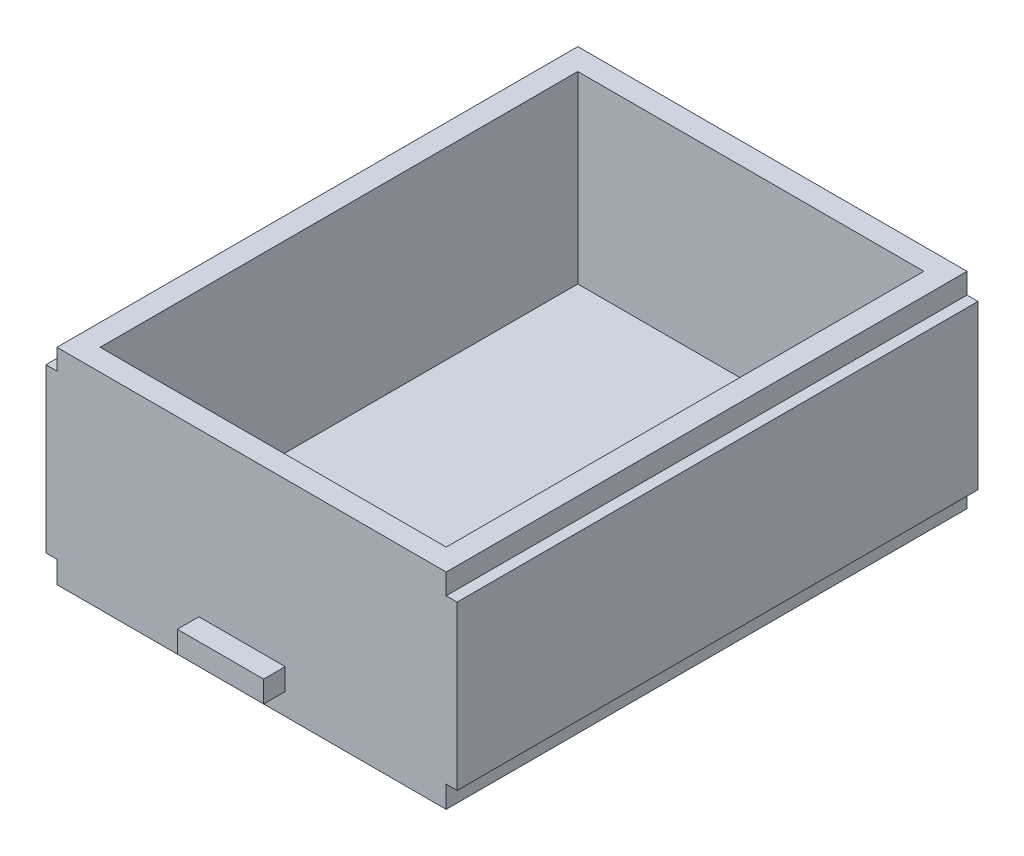
ISO-10303-21;
HEADER;
FILE_DESCRIPTION(('STEP AP214'),'2;1');
FILE_NAME('part.step','',(''),(''),'','','');
FILE_SCHEMA(('AUTOMOTIVE_DESIGN { 1 0 10303 214 1 1 1 1 }'));
ENDSEC;
DATA;
#1=APPLICATION_CONTEXT('core data for automotive mechanical design processes');
#2=APPLICATION_PROTOCOL_DEFINITION('international standard','automotive_design',2000,#1);
#3=PRODUCT_CONTEXT('',#1,'mechanical');
#4=PRODUCT('Part','Part','',(#3));
#5=PRODUCT_RELATED_PRODUCT_CATEGORY('part','',(#4));
#6=PRODUCT_DEFINITION_FORMATION('','',#4);
#7=PRODUCT_DEFINITION_CONTEXT('part definition',#1,'design');
#8=PRODUCT_DEFINITION('design','',#6,#7);
#9=PRODUCT_DEFINITION_SHAPE('','',#8);
#10=(LENGTH_UNIT() NAMED_UNIT(*) SI_UNIT(.MILLI.,.METRE.));
#11=(NAMED_UNIT(*) PLANE_ANGLE_UNIT() SI_UNIT($,.RADIAN.));
#12=(NAMED_UNIT(*) SI_UNIT($,.STERADIAN.) SOLID_ANGLE_UNIT());
#13=UNCERTAINTY_MEASURE_WITH_UNIT(LENGTH_MEASURE(1.E-05),#10,'distance_accuracy_value','');
#14=(GEOMETRIC_REPRESENTATION_CONTEXT(3) GLOBAL_UNCERTAINTY_ASSIGNED_CONTEXT((#13)) GLOBAL_UNIT_ASSIGNED_CONTEXT((#10,
#11,#12)) REPRESENTATION_CONTEXT('',''));
#15=CARTESIAN_POINT('',(0.,0.,0.));
#16=DIRECTION('',(0.,0.,1.));
#17=DIRECTION('',(1.,0.,0.));
#18=AXIS2_PLACEMENT_3D('',#15,#16,#17);
#19=CARTESIAN_POINT('',(0.,0.,96.52));
#20=DIRECTION('',(0.,0.,1.));
#21=DIRECTION('',(1.,0.,0.));
#22=AXIS2_PLACEMENT_3D('',#19,#20,#21);
#23=PLANE('',#22);
#24=DIRECTION('',(0.,-1.,0.));
#25=VECTOR('',#24,1.);
#26=CARTESIAN_POINT('',(-36.068,-19.05,96.52));
#27=LINE('',#26,#25);
#28=CARTESIAN_POINT('',(-36.068,19.05,96.52));
#29=VERTEX_POINT('',#28);
#30=CARTESIAN_POINT('',(-36.068,15.24,96.52));
#31=VERTEX_POINT('',#30);
#32=EDGE_CURVE('E332',#29,#31,#27,.T.);
#33=ORIENTED_EDGE('',*,*,#32,.T.);
#34=DIRECTION('',(-1.,0.,0.));
#35=VECTOR('',#34,1.);
#36=CARTESIAN_POINT('',(-36.068,15.24,96.52));
#37=LINE('',#36,#35);
#38=CARTESIAN_POINT('',(-38.1,15.24,96.52));
#39=VERTEX_POINT('',#38);
#40=EDGE_CURVE('E71',#31,#39,#37,.T.);
#41=ORIENTED_EDGE('',*,*,#40,.T.);
#42=DIRECTION('',(0.,-1.,0.));
#43=VECTOR('',#42,1.);
#44=CARTESIAN_POINT('',(-38.1,15.24,96.52));
#45=LINE('',#44,#43);
#46=CARTESIAN_POINT('',(-38.1,-14.986,96.52));
#47=VERTEX_POINT('',#46);
#48=EDGE_CURVE('E237',#39,#47,#45,.T.);
#49=ORIENTED_EDGE('',*,*,#48,.T.);
#50=DIRECTION('',(1.,0.,0.));
#51=VECTOR('',#50,1.);
#52=CARTESIAN_POINT('',(-36.068,-14.986,96.52));
#53=LINE('',#52,#51);
#54=CARTESIAN_POINT('',(-36.068,-14.986,96.52));
#55=VERTEX_POINT('',#54);
#56=EDGE_CURVE('E227',#47,#55,#53,.T.);
#57=ORIENTED_EDGE('',*,*,#56,.T.);
#58=CARTESIAN_POINT('',(-36.068,-19.05,96.52));
#59=VERTEX_POINT('',#58);
#60=EDGE_CURVE('E337',#55,#59,#27,.T.);
#61=ORIENTED_EDGE('',*,*,#60,.T.);
#62=DIRECTION('',(1.,0.,0.));
#63=VECTOR('',#62,1.);
#64=CARTESIAN_POINT('',(36.068,-19.05,96.52));
#65=LINE('',#64,#63);
#66=CARTESIAN_POINT('',(36.068,-19.05,96.52));
#67=VERTEX_POINT('',#66);
#68=EDGE_CURVE('E336',#59,#67,#65,.T.);
#69=ORIENTED_EDGE('',*,*,#68,.T.);
#70=DIRECTION('',(0.,1.,0.));
#71=VECTOR('',#70,1.);
#72=CARTESIAN_POINT('',(36.068,-19.05,96.52));
#73=LINE('',#72,#71);
#74=CARTESIAN_POINT('',(36.068,-14.986,96.52));
#75=VERTEX_POINT('',#74);
#76=EDGE_CURVE('E341',#67,#75,#73,.T.);
#77=ORIENTED_EDGE('',*,*,#76,.T.);
#78=DIRECTION('',(1.,0.,0.));
#79=VECTOR('',#78,1.);
#80=CARTESIAN_POINT('',(36.068,-14.986,96.52));
#81=LINE('',#80,#79);
#82=CARTESIAN_POINT('',(38.1,-14.986,96.52));
#83=VERTEX_POINT('',#82);
#84=EDGE_CURVE('E238',#75,#83,#81,.T.);
#85=ORIENTED_EDGE('',*,*,#84,.T.);
#86=DIRECTION('',(0.,1.,0.));
#87=VECTOR('',#86,1.);
#88=CARTESIAN_POINT('',(38.1,15.24,96.52));
#89=LINE('',#88,#87);
#90=CARTESIAN_POINT('',(38.1,15.24,96.52));
#91=VERTEX_POINT('',#90);
#92=EDGE_CURVE('E271',#83,#91,#89,.T.);
#93=ORIENTED_EDGE('',*,*,#92,.T.);
#94=DIRECTION('',(-1.,0.,0.));
#95=VECTOR('',#94,1.);
#96=CARTESIAN_POINT('',(36.068,15.24,96.52));
#97=LINE('',#96,#95);
#98=CARTESIAN_POINT('',(36.068,15.24,96.52));
#99=VERTEX_POINT('',#98);
#100=EDGE_CURVE('E267',#91,#99,#97,.T.);
#101=ORIENTED_EDGE('',*,*,#100,.T.);
#102=CARTESIAN_POINT('',(36.068,19.05,96.52));
#103=VERTEX_POINT('',#102);
#104=EDGE_CURVE('E340',#99,#103,#73,.T.);
#105=ORIENTED_EDGE('',*,*,#104,.T.);
#106=DIRECTION('',(-1.,0.,0.));
#107=VECTOR('',#106,1.);
#108=CARTESIAN_POINT('',(36.068,19.05,96.52));
#109=LINE('',#108,#107);
#110=EDGE_CURVE('E345',#103,#29,#109,.T.);
#111=ORIENTED_EDGE('',*,*,#110,.T.);
#112=EDGE_LOOP('',(#33,#41,#49,#57,#61,#69,#77,#85,#93,#101,#105,#111));
#113=FACE_BOUND('',#112,.T.);
#114=DIRECTION('',(1.,0.,0.));
#115=VECTOR('',#114,1.);
#116=CARTESIAN_POINT('',(6.2297280759648,-15.05,96.52));
#117=LINE('',#116,#115);
#118=CARTESIAN_POINT('',(-9.7702719240352,-15.05,96.52));
#119=VERTEX_POINT('',#118);
#120=CARTESIAN_POINT('',(6.2297280759648,-15.05,96.52));
#121=VERTEX_POINT('',#120);
#122=EDGE_CURVE('E575',#119,#121,#117,.T.);
#123=ORIENTED_EDGE('',*,*,#122,.F.);
#124=DIRECTION('',(0.,-1.,0.));
#125=VECTOR('',#124,1.);
#126=CARTESIAN_POINT('',(-9.7702719240352,-15.05,96.52));
#127=LINE('',#126,#125);
#128=CARTESIAN_POINT('',(-9.7702719240352,-11.05,96.52));
#129=VERTEX_POINT('',#128);
#130=EDGE_CURVE('E210',#129,#119,#127,.T.);
#131=ORIENTED_EDGE('',*,*,#130,.F.);
#132=DIRECTION('',(-1.,0.,0.));
#133=VECTOR('',#132,1.);
#134=CARTESIAN_POINT('',(6.2297280759648,-11.05,96.52));
#135=LINE('',#134,#133);
#136=CARTESIAN_POINT('',(6.2297280759648,-11.05,96.52));
#137=VERTEX_POINT('',#136);
#138=EDGE_CURVE('E206',#137,#129,#135,.T.);
#139=ORIENTED_EDGE('',*,*,#138,.F.);
#140=DIRECTION('',(0.,1.,0.));
#141=VECTOR('',#140,1.);
#142=CARTESIAN_POINT('',(6.2297280759648,-15.05,96.52));
#143=LINE('',#142,#141);
#144=EDGE_CURVE('E571',#121,#137,#143,.T.);
#145=ORIENTED_EDGE('',*,*,#144,.F.);
#146=EDGE_LOOP('',(#123,#131,#139,#145));
#147=FACE_BOUND('',#146,.T.);
#148=ADVANCED_FACE('F47',(#113,#147),#23,.T.);
#149=CARTESIAN_POINT('',(-36.068,-19.05,96.52));
#150=DIRECTION('',(1.,0.,0.));
#151=DIRECTION('',(0.,0.,-1.));
#152=AXIS2_PLACEMENT_3D('',#149,#150,#151);
#153=PLANE('',#152);
#154=DIRECTION('',(0.,0.,1.));
#155=VECTOR('',#154,1.);
#156=CARTESIAN_POINT('',(-36.068,-14.986,0.));
#157=LINE('',#156,#155);
#158=CARTESIAN_POINT('',(-36.068,-14.986,0.));
#159=VERTEX_POINT('',#158);
#160=EDGE_CURVE('E245',#159,#55,#157,.T.);
#161=ORIENTED_EDGE('',*,*,#160,.F.);
#162=DIRECTION('',(0.,-1.,0.));
#163=VECTOR('',#162,1.);
#164=CARTESIAN_POINT('',(-36.068,-19.05,0.));
#165=LINE('',#164,#163);
#166=CARTESIAN_POINT('',(-36.068,-19.05,0.));
#167=VERTEX_POINT('',#166);
#168=EDGE_CURVE('E296',#159,#167,#165,.T.);
#169=ORIENTED_EDGE('',*,*,#168,.T.);
#170=DIRECTION('',(0.,0.,-1.));
#171=VECTOR('',#170,1.);
#172=CARTESIAN_POINT('',(-36.068,-19.05,96.52));
#173=LINE('',#172,#171);
#174=EDGE_CURVE('E11',#59,#167,#173,.T.);
#175=ORIENTED_EDGE('',*,*,#174,.F.);
#176=ORIENTED_EDGE('',*,*,#60,.F.);
#177=EDGE_LOOP('',(#161,#169,#175,#176));
#178=FACE_BOUND('',#177,.T.);
#179=ADVANCED_FACE('F397',(#178),#153,.F.);
#180=CARTESIAN_POINT('',(36.068,-19.05,96.52));
#181=DIRECTION('',(-1.,0.,0.));
#182=DIRECTION('',(0.,0.,1.));
#183=AXIS2_PLACEMENT_3D('',#180,#181,#182);
#184=PLANE('',#183);
#185=DIRECTION('',(0.,0.,1.));
#186=VECTOR('',#185,1.);
#187=CARTESIAN_POINT('',(36.068,15.24,0.));
#188=LINE('',#187,#186);
#189=CARTESIAN_POINT('',(36.068,15.24,0.));
#190=VERTEX_POINT('',#189);
#191=EDGE_CURVE('E213',#190,#99,#188,.T.);
#192=ORIENTED_EDGE('',*,*,#191,.F.);
#193=DIRECTION('',(0.,1.,0.));
#194=VECTOR('',#193,1.);
#195=CARTESIAN_POINT('',(36.068,-19.05,0.));
#196=LINE('',#195,#194);
#197=CARTESIAN_POINT('',(36.068,19.05,0.));
#198=VERTEX_POINT('',#197);
#199=EDGE_CURVE('E356',#190,#198,#196,.T.);
#200=ORIENTED_EDGE('',*,*,#199,.T.);
#201=DIRECTION('',(0.,0.,-1.));
#202=VECTOR('',#201,1.);
#203=CARTESIAN_POINT('',(36.068,19.05,96.52));
#204=LINE('',#203,#202);
#205=EDGE_CURVE('E367',#103,#198,#204,.T.);
#206=ORIENTED_EDGE('',*,*,#205,.F.);
#207=ORIENTED_EDGE('',*,*,#104,.F.);
#208=EDGE_LOOP('',(#192,#200,#206,#207));
#209=FACE_BOUND('',#208,.T.);
#210=ADVANCED_FACE('F410',(#209),#184,.F.);
#211=CARTESIAN_POINT('',(36.068,19.05,96.52));
#212=DIRECTION('',(0.,-1.,0.));
#213=DIRECTION('',(1.,0.,0.));
#214=AXIS2_PLACEMENT_3D('',#211,#212,#213);
#215=PLANE('',#214);
#216=DIRECTION('',(-1.,0.,0.));
#217=VECTOR('',#216,1.);
#218=CARTESIAN_POINT('',(36.068,19.05,0.));
#219=LINE('',#218,#217);
#220=CARTESIAN_POINT('',(-36.068,19.05,0.));
#221=VERTEX_POINT('',#220);
#222=EDGE_CURVE('E361',#198,#221,#219,.T.);
#223=ORIENTED_EDGE('',*,*,#222,.T.);
#224=DIRECTION('',(0.,0.,-1.));
#225=VECTOR('',#224,1.);
#226=CARTESIAN_POINT('',(-36.068,19.05,96.52));
#227=LINE('',#226,#225);
#228=EDGE_CURVE('E348',#29,#221,#227,.T.);
#229=ORIENTED_EDGE('',*,*,#228,.F.);
#230=ORIENTED_EDGE('',*,*,#110,.F.);
#231=ORIENTED_EDGE('',*,*,#205,.T.);
#232=EDGE_LOOP('',(#223,#229,#230,#231));
#233=FACE_BOUND('',#232,.T.);
#234=DIRECTION('',(-1.,0.,0.));
#235=VECTOR('',#234,1.);
#236=CARTESIAN_POINT('',(36.068,19.05,4.));
#237=LINE('',#236,#235);
#238=CARTESIAN_POINT('',(32.068,19.05,4.));
#239=VERTEX_POINT('',#238);
#240=CARTESIAN_POINT('',(-32.068,19.05,4.));
#241=VERTEX_POINT('',#240);
#242=EDGE_CURVE('E303',#239,#241,#237,.T.);
#243=ORIENTED_EDGE('',*,*,#242,.F.);
#244=DIRECTION('',(0.,0.,-1.));
#245=VECTOR('',#244,1.);
#246=CARTESIAN_POINT('',(32.068,19.05,96.52));
#247=LINE('',#246,#245);
#248=CARTESIAN_POINT('',(32.068,19.05,92.52));
#249=VERTEX_POINT('',#248);
#250=EDGE_CURVE('E310',#249,#239,#247,.T.);
#251=ORIENTED_EDGE('',*,*,#250,.F.);
#252=DIRECTION('',(-1.,0.,0.));
#253=VECTOR('',#252,1.);
#254=CARTESIAN_POINT('',(36.068,19.05,92.52));
#255=LINE('',#254,#253);
#256=CARTESIAN_POINT('',(-32.068,19.05,92.52));
#257=VERTEX_POINT('',#256);
#258=EDGE_CURVE('E319',#249,#257,#255,.T.);
#259=ORIENTED_EDGE('',*,*,#258,.T.);
#260=DIRECTION('',(0.,0.,-1.));
#261=VECTOR('',#260,1.);
#262=CARTESIAN_POINT('',(-32.068,19.05,96.52));
#263=LINE('',#262,#261);
#264=EDGE_CURVE('E320',#257,#241,#263,.T.);
#265=ORIENTED_EDGE('',*,*,#264,.T.);
#266=EDGE_LOOP('',(#243,#251,#259,#265));
#267=FACE_BOUND('',#266,.T.);
#268=ADVANCED_FACE('F414',(#233,#267),#215,.F.);
#269=CARTESIAN_POINT('',(-36.068,15.24,0.));
#270=VERTEX_POINT('',#269);
#271=EDGE_CURVE('E349',#221,#270,#165,.T.);
#272=ORIENTED_EDGE('',*,*,#271,.T.);
#273=DIRECTION('',(0.,0.,1.));
#274=VECTOR('',#273,1.);
#275=CARTESIAN_POINT('',(-36.068,15.24,0.));
#276=LINE('',#275,#274);
#277=EDGE_CURVE('E234',#270,#31,#276,.T.);
#278=ORIENTED_EDGE('',*,*,#277,.T.);
#279=ORIENTED_EDGE('',*,*,#32,.F.);
#280=ORIENTED_EDGE('',*,*,#228,.T.);
#281=EDGE_LOOP('',(#272,#278,#279,#280));
#282=FACE_BOUND('',#281,.T.);
#283=ADVANCED_FACE('F49',(#282),#153,.F.);
#284=CARTESIAN_POINT('',(36.068,-19.05,96.52));
#285=DIRECTION('',(0.,1.,0.));
#286=DIRECTION('',(-1.,0.,0.));
#287=AXIS2_PLACEMENT_3D('',#284,#285,#286);
#288=PLANE('',#287);
#289=DIRECTION('',(1.,0.,0.));
#290=VECTOR('',#289,1.);
#291=CARTESIAN_POINT('',(36.068,-19.05,0.));
#292=LINE('',#291,#290);
#293=CARTESIAN_POINT('',(36.068,-19.05,0.));
#294=VERTEX_POINT('',#293);
#295=EDGE_CURVE('E353',#167,#294,#292,.T.);
#296=ORIENTED_EDGE('',*,*,#295,.T.);
#297=DIRECTION('',(0.,0.,-1.));
#298=VECTOR('',#297,1.);
#299=CARTESIAN_POINT('',(36.068,-19.05,96.52));
#300=LINE('',#299,#298);
#301=EDGE_CURVE('E56',#67,#294,#300,.T.);
#302=ORIENTED_EDGE('',*,*,#301,.F.);
#303=ORIENTED_EDGE('',*,*,#68,.F.);
#304=ORIENTED_EDGE('',*,*,#174,.T.);
#305=EDGE_LOOP('',(#296,#302,#303,#304));
#306=FACE_BOUND('',#305,.T.);
#307=ADVANCED_FACE('F394',(#306),#288,.F.);
#308=CARTESIAN_POINT('',(36.068,-14.986,0.));
#309=VERTEX_POINT('',#308);
#310=EDGE_CURVE('E357',#294,#309,#196,.T.);
#311=ORIENTED_EDGE('',*,*,#310,.T.);
#312=DIRECTION('',(0.,0.,1.));
#313=VECTOR('',#312,1.);
#314=CARTESIAN_POINT('',(36.068,-14.986,0.));
#315=LINE('',#314,#313);
#316=EDGE_CURVE('E257',#309,#75,#315,.T.);
#317=ORIENTED_EDGE('',*,*,#316,.T.);
#318=ORIENTED_EDGE('',*,*,#76,.F.);
#319=ORIENTED_EDGE('',*,*,#301,.T.);
#320=EDGE_LOOP('',(#311,#317,#318,#319));
#321=FACE_BOUND('',#320,.T.);
#322=ADVANCED_FACE('F376',(#321),#184,.F.);
#323=CARTESIAN_POINT('',(0.,0.,0.));
#324=DIRECTION('',(0.,0.,1.));
#325=DIRECTION('',(1.,0.,0.));
#326=AXIS2_PLACEMENT_3D('',#323,#324,#325);
#327=PLANE('',#326);
#328=ORIENTED_EDGE('',*,*,#271,.F.);
#329=ORIENTED_EDGE('',*,*,#222,.F.);
#330=ORIENTED_EDGE('',*,*,#199,.F.);
#331=DIRECTION('',(-1.,0.,0.));
#332=VECTOR('',#331,1.);
#333=CARTESIAN_POINT('',(36.068,15.24,0.));
#334=LINE('',#333,#332);
#335=CARTESIAN_POINT('',(38.1,15.24,0.));
#336=VERTEX_POINT('',#335);
#337=EDGE_CURVE('E261',#336,#190,#334,.T.);
#338=ORIENTED_EDGE('',*,*,#337,.F.);
#339=DIRECTION('',(0.,1.,0.));
#340=VECTOR('',#339,1.);
#341=CARTESIAN_POINT('',(38.1,15.24,0.));
#342=LINE('',#341,#340);
#343=CARTESIAN_POINT('',(38.1,-14.986,0.));
#344=VERTEX_POINT('',#343);
#345=EDGE_CURVE('E281',#344,#336,#342,.T.);
#346=ORIENTED_EDGE('',*,*,#345,.F.);
#347=DIRECTION('',(1.,0.,0.));
#348=VECTOR('',#347,1.);
#349=CARTESIAN_POINT('',(36.068,-14.986,0.));
#350=LINE('',#349,#348);
#351=EDGE_CURVE('E272',#309,#344,#350,.T.);
#352=ORIENTED_EDGE('',*,*,#351,.F.);
#353=ORIENTED_EDGE('',*,*,#310,.F.);
#354=ORIENTED_EDGE('',*,*,#295,.F.);
#355=ORIENTED_EDGE('',*,*,#168,.F.);
#356=DIRECTION('',(1.,0.,0.));
#357=VECTOR('',#356,1.);
#358=CARTESIAN_POINT('',(-36.068,-14.986,0.));
#359=LINE('',#358,#357);
#360=CARTESIAN_POINT('',(-38.1,-14.986,0.));
#361=VERTEX_POINT('',#360);
#362=EDGE_CURVE('E231',#361,#159,#359,.T.);
#363=ORIENTED_EDGE('',*,*,#362,.F.);
#364=DIRECTION('',(0.,-1.,0.));
#365=VECTOR('',#364,1.);
#366=CARTESIAN_POINT('',(-38.1,15.24,0.));
#367=LINE('',#366,#365);
#368=CARTESIAN_POINT('',(-38.1,15.24,0.));
#369=VERTEX_POINT('',#368);
#370=EDGE_CURVE('E226',#369,#361,#367,.T.);
#371=ORIENTED_EDGE('',*,*,#370,.F.);
#372=DIRECTION('',(-1.,0.,0.));
#373=VECTOR('',#372,1.);
#374=CARTESIAN_POINT('',(-36.068,15.24,0.));
#375=LINE('',#374,#373);
#376=EDGE_CURVE('E222',#270,#369,#375,.T.);
#377=ORIENTED_EDGE('',*,*,#376,.F.);
#378=EDGE_LOOP('',(#328,#329,#330,#338,#346,#352,#353,#354,#355,#363,#371,#377));
#379=FACE_BOUND('',#378,.T.);
#380=ADVANCED_FACE('F383',(#379),#327,.F.);
#381=CARTESIAN_POINT('',(-32.068,-19.05,96.52));
#382=DIRECTION('',(1.,0.,0.));
#383=DIRECTION('',(0.,0.,-1.));
#384=AXIS2_PLACEMENT_3D('',#381,#382,#383);
#385=PLANE('',#384);
#386=DIRECTION('',(0.,-1.,0.));
#387=VECTOR('',#386,1.);
#388=CARTESIAN_POINT('',(-32.068,-19.05,4.));
#389=LINE('',#388,#387);
#390=CARTESIAN_POINT('',(-32.068,-15.05,4.));
#391=VERTEX_POINT('',#390);
#392=EDGE_CURVE('E248',#241,#391,#389,.T.);
#393=ORIENTED_EDGE('',*,*,#392,.F.);
#394=ORIENTED_EDGE('',*,*,#264,.F.);
#395=DIRECTION('',(0.,-1.,0.));
#396=VECTOR('',#395,1.);
#397=CARTESIAN_POINT('',(-32.068,-19.05,92.52));
#398=LINE('',#397,#396);
#399=CARTESIAN_POINT('',(-32.068,-15.05,92.52));
#400=VERTEX_POINT('',#399);
#401=EDGE_CURVE('E298',#257,#400,#398,.T.);
#402=ORIENTED_EDGE('',*,*,#401,.T.);
#403=DIRECTION('',(0.,0.,-1.));
#404=VECTOR('',#403,1.);
#405=CARTESIAN_POINT('',(-32.068,-15.05,96.52));
#406=LINE('',#405,#404);
#407=EDGE_CURVE('E292',#400,#391,#406,.T.);
#408=ORIENTED_EDGE('',*,*,#407,.T.);
#409=EDGE_LOOP('',(#393,#394,#402,#408));
#410=FACE_BOUND('',#409,.T.);
#411=ADVANCED_FACE('F447',(#410),#385,.T.);
#412=CARTESIAN_POINT('',(36.068,-15.05,96.52));
#413=DIRECTION('',(0.,1.,0.));
#414=DIRECTION('',(-1.,0.,0.));
#415=AXIS2_PLACEMENT_3D('',#412,#413,#414);
#416=PLANE('',#415);
#417=DIRECTION('',(1.,0.,0.));
#418=VECTOR('',#417,1.);
#419=CARTESIAN_POINT('',(36.068,-15.05,4.));
#420=LINE('',#419,#418);
#421=CARTESIAN_POINT('',(32.068,-15.05,4.));
#422=VERTEX_POINT('',#421);
#423=EDGE_CURVE('E291',#391,#422,#420,.T.);
#424=ORIENTED_EDGE('',*,*,#423,.F.);
#425=ORIENTED_EDGE('',*,*,#407,.F.);
#426=DIRECTION('',(1.,0.,0.));
#427=VECTOR('',#426,1.);
#428=CARTESIAN_POINT('',(36.068,-15.05,92.52));
#429=LINE('',#428,#427);
#430=CARTESIAN_POINT('',(32.068,-15.05,92.52));
#431=VERTEX_POINT('',#430);
#432=EDGE_CURVE('E302',#400,#431,#429,.T.);
#433=ORIENTED_EDGE('',*,*,#432,.T.);
#434=DIRECTION('',(0.,0.,-1.));
#435=VECTOR('',#434,1.);
#436=CARTESIAN_POINT('',(32.068,-15.05,96.52));
#437=LINE('',#436,#435);
#438=EDGE_CURVE('E297',#431,#422,#437,.T.);
#439=ORIENTED_EDGE('',*,*,#438,.T.);
#440=EDGE_LOOP('',(#424,#425,#433,#439));
#441=FACE_BOUND('',#440,.T.);
#442=ADVANCED_FACE('F620',(#441),#416,.T.);
#443=CARTESIAN_POINT('',(32.068,-19.05,96.52));
#444=DIRECTION('',(-1.,0.,0.));
#445=DIRECTION('',(0.,0.,1.));
#446=AXIS2_PLACEMENT_3D('',#443,#444,#445);
#447=PLANE('',#446);
#448=DIRECTION('',(0.,1.,0.));
#449=VECTOR('',#448,1.);
#450=CARTESIAN_POINT('',(32.068,-19.05,4.));
#451=LINE('',#450,#449);
#452=EDGE_CURVE('E306',#422,#239,#451,.T.);
#453=ORIENTED_EDGE('',*,*,#452,.F.);
#454=ORIENTED_EDGE('',*,*,#438,.F.);
#455=DIRECTION('',(0.,1.,0.));
#456=VECTOR('',#455,1.);
#457=CARTESIAN_POINT('',(32.068,-19.05,92.52));
#458=LINE('',#457,#456);
#459=EDGE_CURVE('E313',#431,#249,#458,.T.);
#460=ORIENTED_EDGE('',*,*,#459,.T.);
#461=ORIENTED_EDGE('',*,*,#250,.T.);
#462=EDGE_LOOP('',(#453,#454,#460,#461));
#463=FACE_BOUND('',#462,.T.);
#464=ADVANCED_FACE('F612',(#463),#447,.T.);
#465=CARTESIAN_POINT('',(0.,0.,92.52));
#466=DIRECTION('',(0.,0.,1.));
#467=DIRECTION('',(1.,0.,0.));
#468=AXIS2_PLACEMENT_3D('',#465,#466,#467);
#469=PLANE('',#468);
#470=ORIENTED_EDGE('',*,*,#401,.F.);
#471=ORIENTED_EDGE('',*,*,#258,.F.);
#472=ORIENTED_EDGE('',*,*,#459,.F.);
#473=ORIENTED_EDGE('',*,*,#432,.F.);
#474=EDGE_LOOP('',(#470,#471,#472,#473));
#475=FACE_BOUND('',#474,.T.);
#476=ADVANCED_FACE('F604',(#475),#469,.F.);
#477=CARTESIAN_POINT('',(0.,0.,4.));
#478=DIRECTION('',(0.,0.,1.));
#479=DIRECTION('',(1.,0.,0.));
#480=AXIS2_PLACEMENT_3D('',#477,#478,#479);
#481=PLANE('',#480);
#482=ORIENTED_EDGE('',*,*,#392,.T.);
#483=ORIENTED_EDGE('',*,*,#423,.T.);
#484=ORIENTED_EDGE('',*,*,#452,.T.);
#485=ORIENTED_EDGE('',*,*,#242,.T.);
#486=EDGE_LOOP('',(#482,#483,#484,#485));
#487=FACE_BOUND('',#486,.T.);
#488=ADVANCED_FACE('F443',(#487),#481,.T.);
#489=CARTESIAN_POINT('',(36.068,15.24,0.));
#490=DIRECTION('',(0.,1.,0.));
#491=DIRECTION('',(0.,0.,1.));
#492=AXIS2_PLACEMENT_3D('',#489,#490,#491);
#493=PLANE('',#492);
#494=ORIENTED_EDGE('',*,*,#100,.F.);
#495=DIRECTION('',(0.,0.,1.));
#496=VECTOR('',#495,1.);
#497=CARTESIAN_POINT('',(38.1,15.24,0.));
#498=LINE('',#497,#496);
#499=EDGE_CURVE('E217',#336,#91,#498,.T.);
#500=ORIENTED_EDGE('',*,*,#499,.F.);
#501=ORIENTED_EDGE('',*,*,#337,.T.);
#502=ORIENTED_EDGE('',*,*,#191,.T.);
#503=EDGE_LOOP('',(#494,#500,#501,#502));
#504=FACE_BOUND('',#503,.T.);
#505=ADVANCED_FACE('F476',(#504),#493,.T.);
#506=CARTESIAN_POINT('',(38.1,15.24,0.));
#507=DIRECTION('',(1.,0.,0.));
#508=DIRECTION('',(0.,1.,0.));
#509=AXIS2_PLACEMENT_3D('',#506,#507,#508);
#510=PLANE('',#509);
#511=ORIENTED_EDGE('',*,*,#92,.F.);
#512=DIRECTION('',(0.,0.,1.));
#513=VECTOR('',#512,1.);
#514=CARTESIAN_POINT('',(38.1,-14.986,0.));
#515=LINE('',#514,#513);
#516=EDGE_CURVE('E262',#344,#83,#515,.T.);
#517=ORIENTED_EDGE('',*,*,#516,.F.);
#518=ORIENTED_EDGE('',*,*,#345,.T.);
#519=ORIENTED_EDGE('',*,*,#499,.T.);
#520=EDGE_LOOP('',(#511,#517,#518,#519));
#521=FACE_BOUND('',#520,.T.);
#522=ADVANCED_FACE('F479',(#521),#510,.T.);
#523=CARTESIAN_POINT('',(36.068,-14.986,0.));
#524=DIRECTION('',(0.,-1.,0.));
#525=DIRECTION('',(1.,0.,0.));
#526=AXIS2_PLACEMENT_3D('',#523,#524,#525);
#527=PLANE('',#526);
#528=ORIENTED_EDGE('',*,*,#84,.F.);
#529=ORIENTED_EDGE('',*,*,#316,.F.);
#530=ORIENTED_EDGE('',*,*,#351,.T.);
#531=ORIENTED_EDGE('',*,*,#516,.T.);
#532=EDGE_LOOP('',(#528,#529,#530,#531));
#533=FACE_BOUND('',#532,.T.);
#534=ADVANCED_FACE('F388',(#533),#527,.T.);
#535=CARTESIAN_POINT('',(-36.068,-14.986,0.));
#536=DIRECTION('',(0.,-1.,0.));
#537=DIRECTION('',(1.,0.,0.));
#538=AXIS2_PLACEMENT_3D('',#535,#536,#537);
#539=PLANE('',#538);
#540=ORIENTED_EDGE('',*,*,#56,.F.);
#541=DIRECTION('',(0.,0.,1.));
#542=VECTOR('',#541,1.);
#543=CARTESIAN_POINT('',(-38.1,-14.986,0.));
#544=LINE('',#543,#542);
#545=EDGE_CURVE('E249',#361,#47,#544,.T.);
#546=ORIENTED_EDGE('',*,*,#545,.F.);
#547=ORIENTED_EDGE('',*,*,#362,.T.);
#548=ORIENTED_EDGE('',*,*,#160,.T.);
#549=EDGE_LOOP('',(#540,#546,#547,#548));
#550=FACE_BOUND('',#549,.T.);
#551=ADVANCED_FACE('F422',(#550),#539,.T.);
#552=CARTESIAN_POINT('',(-38.1,15.24,0.));
#553=DIRECTION('',(-1.,0.,0.));
#554=DIRECTION('',(0.,-1.,0.));
#555=AXIS2_PLACEMENT_3D('',#552,#553,#554);
#556=PLANE('',#555);
#557=ORIENTED_EDGE('',*,*,#48,.F.);
#558=DIRECTION('',(0.,0.,1.));
#559=VECTOR('',#558,1.);
#560=CARTESIAN_POINT('',(-38.1,15.24,0.));
#561=LINE('',#560,#559);
#562=EDGE_CURVE('E252',#369,#39,#561,.T.);
#563=ORIENTED_EDGE('',*,*,#562,.F.);
#564=ORIENTED_EDGE('',*,*,#370,.T.);
#565=ORIENTED_EDGE('',*,*,#545,.T.);
#566=EDGE_LOOP('',(#557,#563,#564,#565));
#567=FACE_BOUND('',#566,.T.);
#568=ADVANCED_FACE('F426',(#567),#556,.T.);
#569=CARTESIAN_POINT('',(-36.068,15.24,0.));
#570=DIRECTION('',(0.,1.,0.));
#571=DIRECTION('',(0.,0.,1.));
#572=AXIS2_PLACEMENT_3D('',#569,#570,#571);
#573=PLANE('',#572);
#574=ORIENTED_EDGE('',*,*,#40,.F.);
#575=ORIENTED_EDGE('',*,*,#277,.F.);
#576=ORIENTED_EDGE('',*,*,#376,.T.);
#577=ORIENTED_EDGE('',*,*,#562,.T.);
#578=EDGE_LOOP('',(#574,#575,#576,#577));
#579=FACE_BOUND('',#578,.T.);
#580=ADVANCED_FACE('F425',(#579),#573,.T.);
#581=CARTESIAN_POINT('',(-9.7702719240352,-15.05,100.52));
#582=DIRECTION('',(1.,0.,0.));
#583=DIRECTION('',(0.,0.,-1.));
#584=AXIS2_PLACEMENT_3D('',#581,#582,#583);
#585=PLANE('',#584);
#586=ORIENTED_EDGE('',*,*,#130,.T.);
#587=DIRECTION('',(0.,0.,-1.));
#588=VECTOR('',#587,1.);
#589=CARTESIAN_POINT('',(-9.7702719240352,-15.05,100.52));
#590=LINE('',#589,#588);
#591=CARTESIAN_POINT('',(-9.7702719240352,-15.05,100.52));
#592=VERTEX_POINT('',#591);
#593=EDGE_CURVE('E189',#592,#119,#590,.T.);
#594=ORIENTED_EDGE('',*,*,#593,.F.);
#595=DIRECTION('',(0.,-1.,0.));
#596=VECTOR('',#595,1.);
#597=CARTESIAN_POINT('',(-9.7702719240352,-15.05,100.52));
#598=LINE('',#597,#596);
#599=CARTESIAN_POINT('',(-9.7702719240352,-11.05,100.52));
#600=VERTEX_POINT('',#599);
#601=EDGE_CURVE('E197',#600,#592,#598,.T.);
#602=ORIENTED_EDGE('',*,*,#601,.F.);
#603=DIRECTION('',(0.,0.,-1.));
#604=VECTOR('',#603,1.);
#605=CARTESIAN_POINT('',(-9.7702719240352,-11.05,100.52));
#606=LINE('',#605,#604);
#607=EDGE_CURVE('E568',#600,#129,#606,.T.);
#608=ORIENTED_EDGE('',*,*,#607,.T.);
#609=EDGE_LOOP('',(#586,#594,#602,#608));
#610=FACE_BOUND('',#609,.T.);
#611=ADVANCED_FACE('F208',(#610),#585,.F.);
#612=CARTESIAN_POINT('',(6.2297280759648,-15.05,100.52));
#613=DIRECTION('',(0.,1.,0.));
#614=DIRECTION('',(-1.,0.,0.));
#615=AXIS2_PLACEMENT_3D('',#612,#613,#614);
#616=PLANE('',#615);
#617=ORIENTED_EDGE('',*,*,#122,.T.);
#618=DIRECTION('',(0.,0.,-1.));
#619=VECTOR('',#618,1.);
#620=CARTESIAN_POINT('',(6.2297280759648,-15.05,100.52));
#621=LINE('',#620,#619);
#622=CARTESIAN_POINT('',(6.2297280759648,-15.05,100.52));
#623=VERTEX_POINT('',#622);
#624=EDGE_CURVE('E192',#623,#121,#621,.T.);
#625=ORIENTED_EDGE('',*,*,#624,.F.);
#626=DIRECTION('',(1.,0.,0.));
#627=VECTOR('',#626,1.);
#628=CARTESIAN_POINT('',(6.2297280759648,-15.05,100.52));
#629=LINE('',#628,#627);
#630=EDGE_CURVE('E185',#592,#623,#629,.T.);
#631=ORIENTED_EDGE('',*,*,#630,.F.);
#632=ORIENTED_EDGE('',*,*,#593,.T.);
#633=EDGE_LOOP('',(#617,#625,#631,#632));
#634=FACE_BOUND('',#633,.T.);
#635=ADVANCED_FACE('F187',(#634),#616,.F.);
#636=CARTESIAN_POINT('',(6.2297280759648,-15.05,100.52));
#637=DIRECTION('',(-1.,0.,0.));
#638=DIRECTION('',(0.,0.,1.));
#639=AXIS2_PLACEMENT_3D('',#636,#637,#638);
#640=PLANE('',#639);
#641=ORIENTED_EDGE('',*,*,#144,.T.);
#642=DIRECTION('',(0.,0.,-1.));
#643=VECTOR('',#642,1.);
#644=CARTESIAN_POINT('',(6.2297280759648,-11.05,100.52));
#645=LINE('',#644,#643);
#646=CARTESIAN_POINT('',(6.2297280759648,-11.05,100.52));
#647=VERTEX_POINT('',#646);
#648=EDGE_CURVE('E63',#647,#137,#645,.T.);
#649=ORIENTED_EDGE('',*,*,#648,.F.);
#650=DIRECTION('',(0.,1.,0.));
#651=VECTOR('',#650,1.);
#652=CARTESIAN_POINT('',(6.2297280759648,-15.05,100.52));
#653=LINE('',#652,#651);
#654=EDGE_CURVE('E196',#623,#647,#653,.T.);
#655=ORIENTED_EDGE('',*,*,#654,.F.);
#656=ORIENTED_EDGE('',*,*,#624,.T.);
#657=EDGE_LOOP('',(#641,#649,#655,#656));
#658=FACE_BOUND('',#657,.T.);
#659=ADVANCED_FACE('F538',(#658),#640,.F.);
#660=CARTESIAN_POINT('',(6.2297280759648,-11.05,100.52));
#661=DIRECTION('',(0.,-1.,0.));
#662=DIRECTION('',(0.,0.,-1.));
#663=AXIS2_PLACEMENT_3D('',#660,#661,#662);
#664=PLANE('',#663);
#665=ORIENTED_EDGE('',*,*,#138,.T.);
#666=ORIENTED_EDGE('',*,*,#607,.F.);
#667=DIRECTION('',(-1.,0.,0.));
#668=VECTOR('',#667,1.);
#669=CARTESIAN_POINT('',(6.2297280759648,-11.05,100.52));
#670=LINE('',#669,#668);
#671=EDGE_CURVE('E201',#647,#600,#670,.T.);
#672=ORIENTED_EDGE('',*,*,#671,.F.);
#673=ORIENTED_EDGE('',*,*,#648,.T.);
#674=EDGE_LOOP('',(#665,#666,#672,#673));
#675=FACE_BOUND('',#674,.T.);
#676=ADVANCED_FACE('F547',(#675),#664,.F.);
#677=CARTESIAN_POINT('',(0.,0.,100.52));
#678=DIRECTION('',(0.,0.,1.));
#679=DIRECTION('',(1.,0.,0.));
#680=AXIS2_PLACEMENT_3D('',#677,#678,#679);
#681=PLANE('',#680);
#682=ORIENTED_EDGE('',*,*,#601,.T.);
#683=ORIENTED_EDGE('',*,*,#630,.T.);
#684=ORIENTED_EDGE('',*,*,#654,.T.);
#685=ORIENTED_EDGE('',*,*,#671,.T.);
#686=EDGE_LOOP('',(#682,#683,#684,#685));
#687=FACE_BOUND('',#686,.T.);
#688=ADVANCED_FACE('F200',(#687),#681,.T.);
#689=CLOSED_SHELL('',(#148,#179,#210,#268,#283,#307,#322,#380,#411,#442,#464,#476,#488,#505,
#522,#534,#551,#568,#580,#611,#635,#659,#676,#688));
#690=MANIFOLD_SOLID_BREP('B2',#689);
#691=ADVANCED_BREP_SHAPE_REPRESENTATION('',(#18,#690),#14);
#692=SHAPE_DEFINITION_REPRESENTATION(#9,#691);
ENDSEC;
END-ISO-10303-21;
